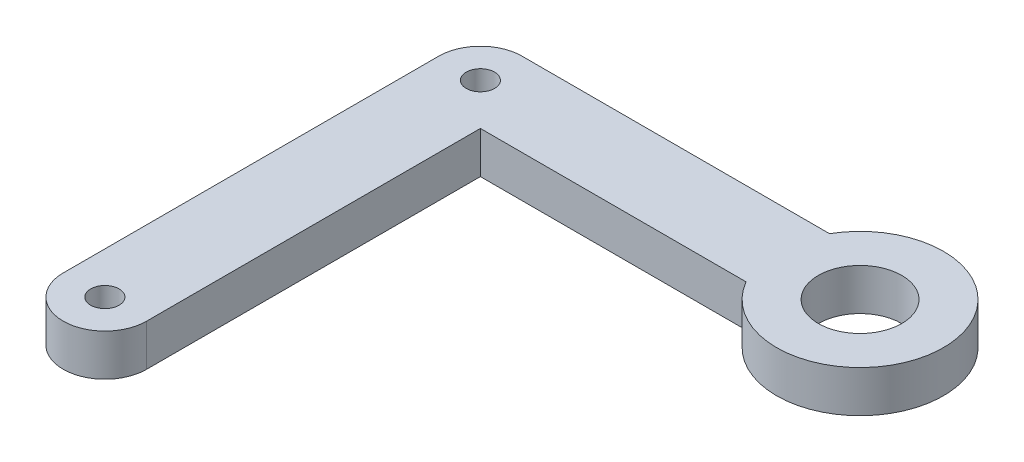
ISO-10303-21;
HEADER;
FILE_DESCRIPTION(('STEP AP214'),'2;1');
FILE_NAME('part.step','',(''),(''),'','','');
FILE_SCHEMA(('AUTOMOTIVE_DESIGN { 1 0 10303 214 1 1 1 1 }'));
ENDSEC;
DATA;
#1=APPLICATION_CONTEXT('core data for automotive mechanical design processes');
#2=APPLICATION_PROTOCOL_DEFINITION('international standard','automotive_design',2000,#1);
#3=PRODUCT_CONTEXT('',#1,'mechanical');
#4=PRODUCT('Part','Part','',(#3));
#5=PRODUCT_RELATED_PRODUCT_CATEGORY('part','',(#4));
#6=PRODUCT_DEFINITION_FORMATION('','',#4);
#7=PRODUCT_DEFINITION_CONTEXT('part definition',#1,'design');
#8=PRODUCT_DEFINITION('design','',#6,#7);
#9=PRODUCT_DEFINITION_SHAPE('','',#8);
#10=(LENGTH_UNIT() NAMED_UNIT(*) SI_UNIT(.MILLI.,.METRE.));
#11=(NAMED_UNIT(*) PLANE_ANGLE_UNIT() SI_UNIT($,.RADIAN.));
#12=(NAMED_UNIT(*) SI_UNIT($,.STERADIAN.) SOLID_ANGLE_UNIT());
#13=UNCERTAINTY_MEASURE_WITH_UNIT(LENGTH_MEASURE(1.E-05),#10,'distance_accuracy_value','');
#14=(GEOMETRIC_REPRESENTATION_CONTEXT(3) GLOBAL_UNCERTAINTY_ASSIGNED_CONTEXT((#13)) GLOBAL_UNIT_ASSIGNED_CONTEXT((#10,
#11,#12)) REPRESENTATION_CONTEXT('',''));
#15=CARTESIAN_POINT('',(0.,0.,0.));
#16=DIRECTION('',(0.,0.,1.));
#17=DIRECTION('',(1.,0.,0.));
#18=AXIS2_PLACEMENT_3D('',#15,#16,#17);
#19=CARTESIAN_POINT('',(0.,5.,0.));
#20=DIRECTION('',(0.,1.,0.));
#21=DIRECTION('',(0.,0.,1.));
#22=AXIS2_PLACEMENT_3D('',#19,#20,#21);
#23=PLANE('',#22);
#24=CARTESIAN_POINT('',(45.5,5.,-45.));
#25=DIRECTION('',(0.,-1.,0.));
#26=DIRECTION('',(0.,0.,-1.));
#27=AXIS2_PLACEMENT_3D('',#24,#25,#26);
#28=CIRCLE('',#27,5.);
#29=CARTESIAN_POINT('',(45.5,5.,-50.));
#30=VERTEX_POINT('',#29);
#31=EDGE_CURVE('E113',#30,#30,#28,.T.);
#32=ORIENTED_EDGE('',*,*,#31,.T.);
#33=EDGE_LOOP('',(#32));
#34=FACE_BOUND('',#33,.T.);
#35=DIRECTION('',(-1.,0.,0.));
#36=VECTOR('',#35,1.);
#37=CARTESIAN_POINT('',(0.,5.,-40.));
#38=LINE('',#37,#36);
#39=CARTESIAN_POINT('',(36.8397459621556,5.,-40.));
#40=VERTEX_POINT('',#39);
#41=CARTESIAN_POINT('',(5.,5.,-40.));
#42=VERTEX_POINT('',#41);
#43=EDGE_CURVE('E55',#40,#42,#38,.T.);
#44=ORIENTED_EDGE('',*,*,#43,.F.);
#45=CARTESIAN_POINT('',(45.5,5.,-45.));
#46=DIRECTION('',(0.,-1.,0.));
#47=DIRECTION('',(0.,0.,-1.));
#48=AXIS2_PLACEMENT_3D('',#45,#46,#47);
#49=CIRCLE('',#48,10.);
#50=CARTESIAN_POINT('',(36.8397459621556,5.,-50.));
#51=VERTEX_POINT('',#50);
#52=EDGE_CURVE('E104',#51,#40,#49,.T.);
#53=ORIENTED_EDGE('',*,*,#52,.F.);
#54=DIRECTION('',(1.,0.,0.));
#55=VECTOR('',#54,1.);
#56=CARTESIAN_POINT('',(0.,5.,-50.));
#57=LINE('',#56,#55);
#58=CARTESIAN_POINT('',(0.,5.,-50.));
#59=VERTEX_POINT('',#58);
#60=EDGE_CURVE('E117',#59,#51,#57,.T.);
#61=ORIENTED_EDGE('',*,*,#60,.F.);
#62=CARTESIAN_POINT('',(0.,5.,-45.));
#63=DIRECTION('',(0.,1.,0.));
#64=DIRECTION('',(0.,0.,1.));
#65=AXIS2_PLACEMENT_3D('',#62,#63,#64);
#66=CIRCLE('',#65,5.);
#67=CARTESIAN_POINT('',(-5.,5.,-45.));
#68=VERTEX_POINT('',#67);
#69=EDGE_CURVE('E156',#59,#68,#66,.T.);
#70=ORIENTED_EDGE('',*,*,#69,.T.);
#71=DIRECTION('',(0.,0.,1.));
#72=VECTOR('',#71,1.);
#73=CARTESIAN_POINT('',(-5.,5.,0.));
#74=LINE('',#73,#72);
#75=CARTESIAN_POINT('',(-5.,5.,0.));
#76=VERTEX_POINT('',#75);
#77=EDGE_CURVE('E159',#68,#76,#74,.T.);
#78=ORIENTED_EDGE('',*,*,#77,.T.);
#79=CARTESIAN_POINT('',(0.,5.,0.));
#80=DIRECTION('',(0.,1.,0.));
#81=DIRECTION('',(0.,0.,1.));
#82=AXIS2_PLACEMENT_3D('',#79,#80,#81);
#83=CIRCLE('',#82,5.);
#84=CARTESIAN_POINT('',(5.,5.,0.));
#85=VERTEX_POINT('',#84);
#86=EDGE_CURVE('E147',#76,#85,#83,.T.);
#87=ORIENTED_EDGE('',*,*,#86,.T.);
#88=DIRECTION('',(0.,0.,-1.));
#89=VECTOR('',#88,1.);
#90=CARTESIAN_POINT('',(5.,5.,0.));
#91=LINE('',#90,#89);
#92=EDGE_CURVE('E151',#85,#42,#91,.T.);
#93=ORIENTED_EDGE('',*,*,#92,.T.);
#94=EDGE_LOOP('',(#44,#53,#61,#70,#78,#87,#93));
#95=FACE_BOUND('',#94,.T.);
#96=CARTESIAN_POINT('',(0.,5.,0.));
#97=DIRECTION('',(0.,1.,0.));
#98=DIRECTION('',(0.,0.,1.));
#99=AXIS2_PLACEMENT_3D('',#96,#97,#98);
#100=CIRCLE('',#99,1.7);
#101=CARTESIAN_POINT('',(0.,5.,1.7));
#102=VERTEX_POINT('',#101);
#103=EDGE_CURVE('E139',#102,#102,#100,.T.);
#104=ORIENTED_EDGE('',*,*,#103,.F.);
#105=EDGE_LOOP('',(#104));
#106=FACE_BOUND('',#105,.T.);
#107=CARTESIAN_POINT('',(0.,5.,-45.));
#108=DIRECTION('',(0.,1.,0.));
#109=DIRECTION('',(0.,0.,1.));
#110=AXIS2_PLACEMENT_3D('',#107,#108,#109);
#111=CIRCLE('',#110,1.7);
#112=CARTESIAN_POINT('',(0.,5.,-43.3));
#113=VERTEX_POINT('',#112);
#114=EDGE_CURVE('E131',#113,#113,#111,.T.);
#115=ORIENTED_EDGE('',*,*,#114,.F.);
#116=EDGE_LOOP('',(#115));
#117=FACE_BOUND('',#116,.T.);
#118=ADVANCED_FACE('F39',(#34,#95,#106,#117),#23,.T.);
#119=CARTESIAN_POINT('',(0.,0.,0.));
#120=DIRECTION('',(0.,1.,0.));
#121=DIRECTION('',(0.,0.,1.));
#122=AXIS2_PLACEMENT_3D('',#119,#120,#121);
#123=PLANE('',#122);
#124=CARTESIAN_POINT('',(45.5,0.,-45.));
#125=DIRECTION('',(0.,-1.,0.));
#126=DIRECTION('',(0.,0.,-1.));
#127=AXIS2_PLACEMENT_3D('',#124,#125,#126);
#128=CIRCLE('',#127,5.);
#129=CARTESIAN_POINT('',(45.5,0.,-50.));
#130=VERTEX_POINT('',#129);
#131=EDGE_CURVE('E208',#130,#130,#128,.T.);
#132=ORIENTED_EDGE('',*,*,#131,.F.);
#133=EDGE_LOOP('',(#132));
#134=FACE_BOUND('',#133,.T.);
#135=DIRECTION('',(1.,0.,0.));
#136=VECTOR('',#135,1.);
#137=CARTESIAN_POINT('',(0.,0.,-50.));
#138=LINE('',#137,#136);
#139=CARTESIAN_POINT('',(0.,0.,-50.));
#140=VERTEX_POINT('',#139);
#141=CARTESIAN_POINT('',(36.8397459621556,0.,-50.));
#142=VERTEX_POINT('',#141);
#143=EDGE_CURVE('E106',#140,#142,#138,.T.);
#144=ORIENTED_EDGE('',*,*,#143,.T.);
#145=CARTESIAN_POINT('',(45.5,0.,-45.));
#146=DIRECTION('',(0.,-1.,0.));
#147=DIRECTION('',(0.,0.,-1.));
#148=AXIS2_PLACEMENT_3D('',#145,#146,#147);
#149=CIRCLE('',#148,10.);
#150=CARTESIAN_POINT('',(36.8397459621556,0.,-40.));
#151=VERTEX_POINT('',#150);
#152=EDGE_CURVE('E101',#142,#151,#149,.T.);
#153=ORIENTED_EDGE('',*,*,#152,.T.);
#154=DIRECTION('',(-1.,0.,0.));
#155=VECTOR('',#154,1.);
#156=CARTESIAN_POINT('',(0.,0.,-40.));
#157=LINE('',#156,#155);
#158=CARTESIAN_POINT('',(5.,0.,-40.));
#159=VERTEX_POINT('',#158);
#160=EDGE_CURVE('E63',#151,#159,#157,.T.);
#161=ORIENTED_EDGE('',*,*,#160,.T.);
#162=DIRECTION('',(0.,0.,-1.));
#163=VECTOR('',#162,1.);
#164=CARTESIAN_POINT('',(5.,0.,0.));
#165=LINE('',#164,#163);
#166=CARTESIAN_POINT('',(5.,0.,0.));
#167=VERTEX_POINT('',#166);
#168=EDGE_CURVE('E166',#167,#159,#165,.T.);
#169=ORIENTED_EDGE('',*,*,#168,.F.);
#170=CARTESIAN_POINT('',(0.,0.,0.));
#171=DIRECTION('',(0.,1.,0.));
#172=DIRECTION('',(0.,0.,1.));
#173=AXIS2_PLACEMENT_3D('',#170,#171,#172);
#174=CIRCLE('',#173,5.);
#175=CARTESIAN_POINT('',(-5.,0.,0.));
#176=VERTEX_POINT('',#175);
#177=EDGE_CURVE('E143',#176,#167,#174,.T.);
#178=ORIENTED_EDGE('',*,*,#177,.F.);
#179=DIRECTION('',(0.,0.,1.));
#180=VECTOR('',#179,1.);
#181=CARTESIAN_POINT('',(-5.,0.,0.));
#182=LINE('',#181,#180);
#183=CARTESIAN_POINT('',(-5.,0.,-45.));
#184=VERTEX_POINT('',#183);
#185=EDGE_CURVE('E152',#184,#176,#182,.T.);
#186=ORIENTED_EDGE('',*,*,#185,.F.);
#187=CARTESIAN_POINT('',(0.,0.,-45.));
#188=DIRECTION('',(0.,1.,0.));
#189=DIRECTION('',(0.,0.,1.));
#190=AXIS2_PLACEMENT_3D('',#187,#188,#189);
#191=CIRCLE('',#190,5.);
#192=EDGE_CURVE('E169',#140,#184,#191,.T.);
#193=ORIENTED_EDGE('',*,*,#192,.F.);
#194=EDGE_LOOP('',(#144,#153,#161,#169,#178,#186,#193));
#195=FACE_BOUND('',#194,.T.);
#196=CARTESIAN_POINT('',(0.,0.,0.));
#197=DIRECTION('',(0.,1.,0.));
#198=DIRECTION('',(0.,0.,1.));
#199=AXIS2_PLACEMENT_3D('',#196,#197,#198);
#200=CIRCLE('',#199,1.7);
#201=CARTESIAN_POINT('',(0.,0.,1.7));
#202=VERTEX_POINT('',#201);
#203=EDGE_CURVE('E135',#202,#202,#200,.T.);
#204=ORIENTED_EDGE('',*,*,#203,.T.);
#205=EDGE_LOOP('',(#204));
#206=FACE_BOUND('',#205,.T.);
#207=CARTESIAN_POINT('',(0.,0.,-45.));
#208=DIRECTION('',(0.,1.,0.));
#209=DIRECTION('',(0.,0.,1.));
#210=AXIS2_PLACEMENT_3D('',#207,#208,#209);
#211=CIRCLE('',#210,1.7);
#212=CARTESIAN_POINT('',(0.,0.,-43.3));
#213=VERTEX_POINT('',#212);
#214=EDGE_CURVE('E130',#213,#213,#211,.T.);
#215=ORIENTED_EDGE('',*,*,#214,.T.);
#216=EDGE_LOOP('',(#215));
#217=FACE_BOUND('',#216,.T.);
#218=ADVANCED_FACE('F109',(#134,#195,#206,#217),#123,.F.);
#219=CARTESIAN_POINT('',(0.,5.,0.));
#220=DIRECTION('',(0.,-1.,0.));
#221=DIRECTION('',(0.,0.,-1.));
#222=AXIS2_PLACEMENT_3D('',#219,#220,#221);
#223=CYLINDRICAL_SURFACE('',#222,5.);
#224=ORIENTED_EDGE('',*,*,#177,.T.);
#225=DIRECTION('',(0.,-1.,0.));
#226=VECTOR('',#225,1.);
#227=CARTESIAN_POINT('',(5.,5.,0.));
#228=LINE('',#227,#226);
#229=EDGE_CURVE('E181',#85,#167,#228,.T.);
#230=ORIENTED_EDGE('',*,*,#229,.F.);
#231=ORIENTED_EDGE('',*,*,#86,.F.);
#232=DIRECTION('',(0.,-1.,0.));
#233=VECTOR('',#232,1.);
#234=CARTESIAN_POINT('',(-5.,5.,0.));
#235=LINE('',#234,#233);
#236=EDGE_CURVE('E162',#76,#176,#235,.T.);
#237=ORIENTED_EDGE('',*,*,#236,.T.);
#238=EDGE_LOOP('',(#224,#230,#231,#237));
#239=FACE_BOUND('',#238,.T.);
#240=ADVANCED_FACE('F41',(#239),#223,.T.);
#241=CARTESIAN_POINT('',(5.,5.,0.));
#242=DIRECTION('',(-1.,0.,0.));
#243=DIRECTION('',(0.,0.,1.));
#244=AXIS2_PLACEMENT_3D('',#241,#242,#243);
#245=PLANE('',#244);
#246=ORIENTED_EDGE('',*,*,#168,.T.);
#247=DIRECTION('',(0.,1.,0.));
#248=VECTOR('',#247,1.);
#249=CARTESIAN_POINT('',(5.,5.,-40.));
#250=LINE('',#249,#248);
#251=EDGE_CURVE('E48',#159,#42,#250,.T.);
#252=ORIENTED_EDGE('',*,*,#251,.T.);
#253=ORIENTED_EDGE('',*,*,#92,.F.);
#254=ORIENTED_EDGE('',*,*,#229,.T.);
#255=EDGE_LOOP('',(#246,#252,#253,#254));
#256=FACE_BOUND('',#255,.T.);
#257=ADVANCED_FACE('F186',(#256),#245,.F.);
#258=CARTESIAN_POINT('',(0.,5.,-45.));
#259=DIRECTION('',(0.,-1.,0.));
#260=DIRECTION('',(0.,0.,-1.));
#261=AXIS2_PLACEMENT_3D('',#258,#259,#260);
#262=CYLINDRICAL_SURFACE('',#261,5.);
#263=ORIENTED_EDGE('',*,*,#69,.F.);
#264=DIRECTION('',(0.,-1.,0.));
#265=VECTOR('',#264,1.);
#266=CARTESIAN_POINT('',(0.,5.,-50.));
#267=LINE('',#266,#265);
#268=EDGE_CURVE('E126',#59,#140,#267,.T.);
#269=ORIENTED_EDGE('',*,*,#268,.T.);
#270=ORIENTED_EDGE('',*,*,#192,.T.);
#271=DIRECTION('',(0.,-1.,0.));
#272=VECTOR('',#271,1.);
#273=CARTESIAN_POINT('',(-5.,5.,-45.));
#274=LINE('',#273,#272);
#275=EDGE_CURVE('E177',#68,#184,#274,.T.);
#276=ORIENTED_EDGE('',*,*,#275,.F.);
#277=EDGE_LOOP('',(#263,#269,#270,#276));
#278=FACE_BOUND('',#277,.T.);
#279=ADVANCED_FACE('F200',(#278),#262,.T.);
#280=CARTESIAN_POINT('',(-5.,5.,0.));
#281=DIRECTION('',(1.,0.,0.));
#282=DIRECTION('',(0.,0.,-1.));
#283=AXIS2_PLACEMENT_3D('',#280,#281,#282);
#284=PLANE('',#283);
#285=ORIENTED_EDGE('',*,*,#185,.T.);
#286=ORIENTED_EDGE('',*,*,#236,.F.);
#287=ORIENTED_EDGE('',*,*,#77,.F.);
#288=ORIENTED_EDGE('',*,*,#275,.T.);
#289=EDGE_LOOP('',(#285,#286,#287,#288));
#290=FACE_BOUND('',#289,.T.);
#291=ADVANCED_FACE('F197',(#290),#284,.F.);
#292=CARTESIAN_POINT('',(0.,5.,0.));
#293=DIRECTION('',(0.,-1.,0.));
#294=DIRECTION('',(0.,0.,-1.));
#295=AXIS2_PLACEMENT_3D('',#292,#293,#294);
#296=CYLINDRICAL_SURFACE('',#295,1.7);
#297=ORIENTED_EDGE('',*,*,#103,.T.);
#298=EDGE_LOOP('',(#297));
#299=FACE_BOUND('',#298,.T.);
#300=ORIENTED_EDGE('',*,*,#203,.F.);
#301=EDGE_LOOP('',(#300));
#302=FACE_BOUND('',#301,.T.);
#303=ADVANCED_FACE('F236',(#299,#302),#296,.F.);
#304=CARTESIAN_POINT('',(0.,5.,-45.));
#305=DIRECTION('',(0.,-1.,0.));
#306=DIRECTION('',(0.,0.,-1.));
#307=AXIS2_PLACEMENT_3D('',#304,#305,#306);
#308=CYLINDRICAL_SURFACE('',#307,1.7);
#309=ORIENTED_EDGE('',*,*,#114,.T.);
#310=EDGE_LOOP('',(#309));
#311=FACE_BOUND('',#310,.T.);
#312=ORIENTED_EDGE('',*,*,#214,.F.);
#313=EDGE_LOOP('',(#312));
#314=FACE_BOUND('',#313,.T.);
#315=ADVANCED_FACE('F245',(#311,#314),#308,.F.);
#316=CARTESIAN_POINT('',(0.,5.,-40.));
#317=DIRECTION('',(0.,0.,1.));
#318=DIRECTION('',(1.,0.,0.));
#319=AXIS2_PLACEMENT_3D('',#316,#317,#318);
#320=PLANE('',#319);
#321=DIRECTION('',(0.,-1.,0.));
#322=VECTOR('',#321,1.);
#323=CARTESIAN_POINT('',(36.8397459621556,5.,-40.));
#324=LINE('',#323,#322);
#325=EDGE_CURVE('E99',#40,#151,#324,.T.);
#326=ORIENTED_EDGE('',*,*,#325,.F.);
#327=ORIENTED_EDGE('',*,*,#43,.T.);
#328=ORIENTED_EDGE('',*,*,#251,.F.);
#329=ORIENTED_EDGE('',*,*,#160,.F.);
#330=EDGE_LOOP('',(#326,#327,#328,#329));
#331=FACE_BOUND('',#330,.T.);
#332=ADVANCED_FACE('F115',(#331),#320,.T.);
#333=CARTESIAN_POINT('',(0.,5.,-50.));
#334=DIRECTION('',(0.,0.,-1.));
#335=DIRECTION('',(-1.,0.,0.));
#336=AXIS2_PLACEMENT_3D('',#333,#334,#335);
#337=PLANE('',#336);
#338=DIRECTION('',(0.,-1.,0.));
#339=VECTOR('',#338,1.);
#340=CARTESIAN_POINT('',(36.8397459621556,5.,-50.));
#341=LINE('',#340,#339);
#342=EDGE_CURVE('E11',#142,#51,#341,.F.);
#343=ORIENTED_EDGE('',*,*,#342,.F.);
#344=ORIENTED_EDGE('',*,*,#143,.F.);
#345=ORIENTED_EDGE('',*,*,#268,.F.);
#346=ORIENTED_EDGE('',*,*,#60,.T.);
#347=EDGE_LOOP('',(#343,#344,#345,#346));
#348=FACE_BOUND('',#347,.T.);
#349=ADVANCED_FACE('F204',(#348),#337,.T.);
#350=CARTESIAN_POINT('',(45.5,5.,-45.));
#351=DIRECTION('',(0.,-1.,0.));
#352=DIRECTION('',(0.,0.,-1.));
#353=AXIS2_PLACEMENT_3D('',#350,#351,#352);
#354=CYLINDRICAL_SURFACE('',#353,10.);
#355=ORIENTED_EDGE('',*,*,#52,.T.);
#356=ORIENTED_EDGE('',*,*,#325,.T.);
#357=ORIENTED_EDGE('',*,*,#152,.F.);
#358=ORIENTED_EDGE('',*,*,#342,.T.);
#359=EDGE_LOOP('',(#355,#356,#357,#358));
#360=FACE_BOUND('',#359,.T.);
#361=ADVANCED_FACE('F100',(#360),#354,.T.);
#362=CARTESIAN_POINT('',(45.5,5.,-45.));
#363=DIRECTION('',(0.,-1.,0.));
#364=DIRECTION('',(0.,0.,-1.));
#365=AXIS2_PLACEMENT_3D('',#362,#363,#364);
#366=CYLINDRICAL_SURFACE('',#365,5.);
#367=ORIENTED_EDGE('',*,*,#31,.F.);
#368=EDGE_LOOP('',(#367));
#369=FACE_BOUND('',#368,.T.);
#370=ORIENTED_EDGE('',*,*,#131,.T.);
#371=EDGE_LOOP('',(#370));
#372=FACE_BOUND('',#371,.T.);
#373=ADVANCED_FACE('F218',(#369,#372),#366,.F.);
#374=CLOSED_SHELL('',(#118,#218,#240,#257,#279,#291,#303,#315,#332,#349,#361,#373));
#375=MANIFOLD_SOLID_BREP('B2',#374);
#376=ADVANCED_BREP_SHAPE_REPRESENTATION('',(#18,#375),#14);
#377=SHAPE_DEFINITION_REPRESENTATION(#9,#376);
ENDSEC;
END-ISO-10303-21;
